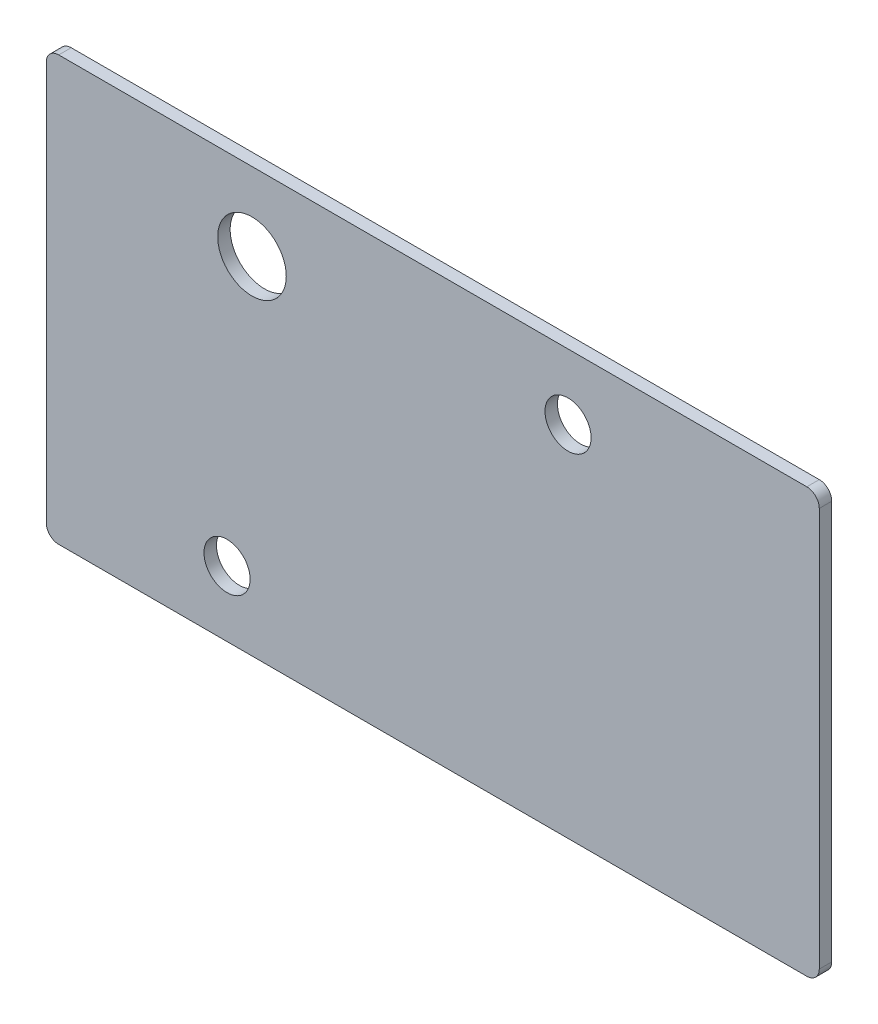
ISO-10303-21;
HEADER;
FILE_DESCRIPTION(('STEP AP214'),'2;1');
FILE_NAME('part.step','',(''),(''),'','','');
FILE_SCHEMA(('AUTOMOTIVE_DESIGN { 1 0 10303 214 1 1 1 1 }'));
ENDSEC;
DATA;
#1=APPLICATION_CONTEXT('core data for automotive mechanical design processes');
#2=APPLICATION_PROTOCOL_DEFINITION('international standard','automotive_design',2000,#1);
#3=PRODUCT_CONTEXT('',#1,'mechanical');
#4=PRODUCT('Part','Part','',(#3));
#5=PRODUCT_RELATED_PRODUCT_CATEGORY('part','',(#4));
#6=PRODUCT_DEFINITION_FORMATION('','',#4);
#7=PRODUCT_DEFINITION_CONTEXT('part definition',#1,'design');
#8=PRODUCT_DEFINITION('design','',#6,#7);
#9=PRODUCT_DEFINITION_SHAPE('','',#8);
#10=(LENGTH_UNIT() NAMED_UNIT(*) SI_UNIT(.MILLI.,.METRE.));
#11=(NAMED_UNIT(*) PLANE_ANGLE_UNIT() SI_UNIT($,.RADIAN.));
#12=(NAMED_UNIT(*) SI_UNIT($,.STERADIAN.) SOLID_ANGLE_UNIT());
#13=UNCERTAINTY_MEASURE_WITH_UNIT(LENGTH_MEASURE(1.E-05),#10,'distance_accuracy_value','');
#14=(GEOMETRIC_REPRESENTATION_CONTEXT(3) GLOBAL_UNCERTAINTY_ASSIGNED_CONTEXT((#13)) GLOBAL_UNIT_ASSIGNED_CONTEXT((#10,
#11,#12)) REPRESENTATION_CONTEXT('',''));
#15=CARTESIAN_POINT('',(0.,0.,0.));
#16=DIRECTION('',(0.,0.,1.));
#17=DIRECTION('',(1.,0.,0.));
#18=AXIS2_PLACEMENT_3D('',#15,#16,#17);
#19=CARTESIAN_POINT('',(-5.,-1.25,1.));
#20=DIRECTION('',(0.,0.,1.));
#21=DIRECTION('',(1.,0.,0.));
#22=AXIS2_PLACEMENT_3D('',#19,#20,#21);
#23=PLANE('',#22);
#24=CARTESIAN_POINT('',(10.5,25.5,1.));
#25=DIRECTION('',(0.,0.,1.));
#26=DIRECTION('',(1.,0.,0.));
#27=AXIS2_PLACEMENT_3D('',#24,#25,#26);
#28=CIRCLE('',#27,2.75);
#29=CARTESIAN_POINT('',(13.25,25.5,1.));
#30=VERTEX_POINT('',#29);
#31=EDGE_CURVE('E191',#30,#30,#28,.T.);
#32=ORIENTED_EDGE('',*,*,#31,.F.);
#33=EDGE_LOOP('',(#32));
#34=FACE_BOUND('',#33,.T.);
#35=CARTESIAN_POINT('',(35.85,26.5,1.));
#36=DIRECTION('',(0.,0.,1.));
#37=DIRECTION('',(1.,0.,0.));
#38=AXIS2_PLACEMENT_3D('',#35,#36,#37);
#39=CIRCLE('',#38,1.85);
#40=CARTESIAN_POINT('',(37.7,26.5,1.));
#41=VERTEX_POINT('',#40);
#42=EDGE_CURVE('E134',#41,#41,#39,.T.);
#43=ORIENTED_EDGE('',*,*,#42,.F.);
#44=EDGE_LOOP('',(#43));
#45=FACE_BOUND('',#44,.T.);
#46=CARTESIAN_POINT('',(-5.,-1.25,1.));
#47=DIRECTION('',(0.,0.,1.));
#48=DIRECTION('',(1.,0.,0.));
#49=AXIS2_PLACEMENT_3D('',#46,#47,#48);
#50=CIRCLE('',#49,1.);
#51=CARTESIAN_POINT('',(-6.,-1.25,1.));
#52=VERTEX_POINT('',#51);
#53=CARTESIAN_POINT('',(-5.,-2.25,1.));
#54=VERTEX_POINT('',#53);
#55=EDGE_CURVE('E145',#52,#54,#50,.T.);
#56=ORIENTED_EDGE('',*,*,#55,.T.);
#57=DIRECTION('',(1.,0.,0.));
#58=VECTOR('',#57,1.);
#59=CARTESIAN_POINT('',(-5.,-2.25,1.));
#60=LINE('',#59,#58);
#61=CARTESIAN_POINT('',(55.,-2.25,1.));
#62=VERTEX_POINT('',#61);
#63=EDGE_CURVE('E93',#54,#62,#60,.T.);
#64=ORIENTED_EDGE('',*,*,#63,.T.);
#65=CARTESIAN_POINT('',(55.,-1.25,1.));
#66=DIRECTION('',(0.,0.,1.));
#67=DIRECTION('',(1.,0.,0.));
#68=AXIS2_PLACEMENT_3D('',#65,#66,#67);
#69=CIRCLE('',#68,1.);
#70=CARTESIAN_POINT('',(56.,-1.25,1.));
#71=VERTEX_POINT('',#70);
#72=EDGE_CURVE('E160',#62,#71,#69,.T.);
#73=ORIENTED_EDGE('',*,*,#72,.T.);
#74=DIRECTION('',(0.,1.,0.));
#75=VECTOR('',#74,1.);
#76=CARTESIAN_POINT('',(56.,-1.25,1.));
#77=LINE('',#76,#75);
#78=CARTESIAN_POINT('',(56.,30.75,1.));
#79=VERTEX_POINT('',#78);
#80=EDGE_CURVE('E173',#71,#79,#77,.T.);
#81=ORIENTED_EDGE('',*,*,#80,.T.);
#82=CARTESIAN_POINT('',(55.,30.75,1.));
#83=DIRECTION('',(0.,0.,1.));
#84=DIRECTION('',(1.,0.,0.));
#85=AXIS2_PLACEMENT_3D('',#82,#83,#84);
#86=CIRCLE('',#85,1.);
#87=CARTESIAN_POINT('',(55.,31.75,1.));
#88=VERTEX_POINT('',#87);
#89=EDGE_CURVE('E112',#79,#88,#86,.T.);
#90=ORIENTED_EDGE('',*,*,#89,.T.);
#91=DIRECTION('',(-1.,0.,0.));
#92=VECTOR('',#91,1.);
#93=CARTESIAN_POINT('',(-5.,31.75,1.));
#94=LINE('',#93,#92);
#95=CARTESIAN_POINT('',(-5.,31.75,1.));
#96=VERTEX_POINT('',#95);
#97=EDGE_CURVE('E106',#88,#96,#94,.T.);
#98=ORIENTED_EDGE('',*,*,#97,.T.);
#99=CARTESIAN_POINT('',(-5.,30.75,1.));
#100=DIRECTION('',(0.,0.,1.));
#101=DIRECTION('',(1.,0.,0.));
#102=AXIS2_PLACEMENT_3D('',#99,#100,#101);
#103=CIRCLE('',#102,1.);
#104=CARTESIAN_POINT('',(-6.,30.75,1.));
#105=VERTEX_POINT('',#104);
#106=EDGE_CURVE('E110',#96,#105,#103,.T.);
#107=ORIENTED_EDGE('',*,*,#106,.T.);
#108=DIRECTION('',(0.,-1.,0.));
#109=VECTOR('',#108,1.);
#110=CARTESIAN_POINT('',(-6.,-1.25,1.));
#111=LINE('',#110,#109);
#112=EDGE_CURVE('E50',#105,#52,#111,.T.);
#113=ORIENTED_EDGE('',*,*,#112,.T.);
#114=EDGE_LOOP('',(#56,#64,#73,#81,#90,#98,#107,#113));
#115=FACE_BOUND('',#114,.T.);
#116=CARTESIAN_POINT('',(8.5,3.,1.));
#117=DIRECTION('',(0.,0.,1.));
#118=DIRECTION('',(1.,0.,0.));
#119=AXIS2_PLACEMENT_3D('',#116,#117,#118);
#120=CIRCLE('',#119,1.85);
#121=CARTESIAN_POINT('',(10.35,3.,1.));
#122=VERTEX_POINT('',#121);
#123=EDGE_CURVE('E182',#122,#122,#120,.T.);
#124=ORIENTED_EDGE('',*,*,#123,.F.);
#125=EDGE_LOOP('',(#124));
#126=FACE_BOUND('',#125,.T.);
#127=ADVANCED_FACE('F33',(#34,#45,#115,#126),#23,.T.);
#128=CARTESIAN_POINT('',(-5.,-1.25,0.));
#129=DIRECTION('',(0.,0.,1.));
#130=DIRECTION('',(1.,0.,0.));
#131=AXIS2_PLACEMENT_3D('',#128,#129,#130);
#132=PLANE('',#131);
#133=CARTESIAN_POINT('',(10.5,25.5,0.));
#134=DIRECTION('',(0.,0.,1.));
#135=DIRECTION('',(1.,0.,0.));
#136=AXIS2_PLACEMENT_3D('',#133,#134,#135);
#137=CIRCLE('',#136,2.75);
#138=CARTESIAN_POINT('',(13.25,25.5,0.));
#139=VERTEX_POINT('',#138);
#140=EDGE_CURVE('E188',#139,#139,#137,.T.);
#141=ORIENTED_EDGE('',*,*,#140,.T.);
#142=EDGE_LOOP('',(#141));
#143=FACE_BOUND('',#142,.T.);
#144=CARTESIAN_POINT('',(35.85,26.5,0.));
#145=DIRECTION('',(0.,0.,1.));
#146=DIRECTION('',(1.,0.,0.));
#147=AXIS2_PLACEMENT_3D('',#144,#145,#146);
#148=CIRCLE('',#147,1.85);
#149=CARTESIAN_POINT('',(37.7,26.5,0.));
#150=VERTEX_POINT('',#149);
#151=EDGE_CURVE('E179',#150,#150,#148,.T.);
#152=ORIENTED_EDGE('',*,*,#151,.T.);
#153=EDGE_LOOP('',(#152));
#154=FACE_BOUND('',#153,.T.);
#155=CARTESIAN_POINT('',(-5.,-1.25,0.));
#156=DIRECTION('',(0.,0.,1.));
#157=DIRECTION('',(1.,0.,0.));
#158=AXIS2_PLACEMENT_3D('',#155,#156,#157);
#159=CIRCLE('',#158,1.);
#160=CARTESIAN_POINT('',(-6.,-1.25,0.));
#161=VERTEX_POINT('',#160);
#162=CARTESIAN_POINT('',(-5.,-2.25,0.));
#163=VERTEX_POINT('',#162);
#164=EDGE_CURVE('E130',#161,#163,#159,.T.);
#165=ORIENTED_EDGE('',*,*,#164,.F.);
#166=DIRECTION('',(0.,-1.,0.));
#167=VECTOR('',#166,1.);
#168=CARTESIAN_POINT('',(-6.,-1.25,0.));
#169=LINE('',#168,#167);
#170=CARTESIAN_POINT('',(-6.,30.75,0.));
#171=VERTEX_POINT('',#170);
#172=EDGE_CURVE('E85',#171,#161,#169,.T.);
#173=ORIENTED_EDGE('',*,*,#172,.F.);
#174=CARTESIAN_POINT('',(-5.,30.75,0.));
#175=DIRECTION('',(0.,0.,1.));
#176=DIRECTION('',(1.,0.,0.));
#177=AXIS2_PLACEMENT_3D('',#174,#175,#176);
#178=CIRCLE('',#177,1.);
#179=CARTESIAN_POINT('',(-5.,31.75,0.));
#180=VERTEX_POINT('',#179);
#181=EDGE_CURVE('E79',#180,#171,#178,.T.);
#182=ORIENTED_EDGE('',*,*,#181,.F.);
#183=DIRECTION('',(-1.,0.,0.));
#184=VECTOR('',#183,1.);
#185=CARTESIAN_POINT('',(-5.,31.75,0.));
#186=LINE('',#185,#184);
#187=CARTESIAN_POINT('',(55.,31.75,0.));
#188=VERTEX_POINT('',#187);
#189=EDGE_CURVE('E120',#188,#180,#186,.T.);
#190=ORIENTED_EDGE('',*,*,#189,.F.);
#191=CARTESIAN_POINT('',(55.,30.75,0.));
#192=DIRECTION('',(0.,0.,1.));
#193=DIRECTION('',(1.,0.,0.));
#194=AXIS2_PLACEMENT_3D('',#191,#192,#193);
#195=CIRCLE('',#194,1.);
#196=CARTESIAN_POINT('',(56.,30.75,0.));
#197=VERTEX_POINT('',#196);
#198=EDGE_CURVE('E140',#197,#188,#195,.T.);
#199=ORIENTED_EDGE('',*,*,#198,.F.);
#200=DIRECTION('',(0.,1.,0.));
#201=VECTOR('',#200,1.);
#202=CARTESIAN_POINT('',(56.,-1.25,0.));
#203=LINE('',#202,#201);
#204=CARTESIAN_POINT('',(56.,-1.25,0.));
#205=VERTEX_POINT('',#204);
#206=EDGE_CURVE('E138',#205,#197,#203,.T.);
#207=ORIENTED_EDGE('',*,*,#206,.F.);
#208=CARTESIAN_POINT('',(55.,-1.25,0.));
#209=DIRECTION('',(0.,0.,1.));
#210=DIRECTION('',(1.,0.,0.));
#211=AXIS2_PLACEMENT_3D('',#208,#209,#210);
#212=CIRCLE('',#211,1.);
#213=CARTESIAN_POINT('',(55.,-2.25,0.));
#214=VERTEX_POINT('',#213);
#215=EDGE_CURVE('E136',#214,#205,#212,.T.);
#216=ORIENTED_EDGE('',*,*,#215,.F.);
#217=DIRECTION('',(1.,0.,0.));
#218=VECTOR('',#217,1.);
#219=CARTESIAN_POINT('',(-5.,-2.25,0.));
#220=LINE('',#219,#218);
#221=EDGE_CURVE('E133',#163,#214,#220,.T.);
#222=ORIENTED_EDGE('',*,*,#221,.F.);
#223=EDGE_LOOP('',(#165,#173,#182,#190,#199,#207,#216,#222));
#224=FACE_BOUND('',#223,.T.);
#225=CARTESIAN_POINT('',(8.5,3.,0.));
#226=DIRECTION('',(0.,0.,1.));
#227=DIRECTION('',(1.,0.,0.));
#228=AXIS2_PLACEMENT_3D('',#225,#226,#227);
#229=CIRCLE('',#228,1.85);
#230=CARTESIAN_POINT('',(10.35,3.,0.));
#231=VERTEX_POINT('',#230);
#232=EDGE_CURVE('E185',#231,#231,#229,.T.);
#233=ORIENTED_EDGE('',*,*,#232,.T.);
#234=EDGE_LOOP('',(#233));
#235=FACE_BOUND('',#234,.T.);
#236=ADVANCED_FACE('F164',(#143,#154,#224,#235),#132,.F.);
#237=CARTESIAN_POINT('',(-5.,-1.25,1.));
#238=DIRECTION('',(0.,0.,-1.));
#239=DIRECTION('',(-1.,0.,0.));
#240=AXIS2_PLACEMENT_3D('',#237,#238,#239);
#241=CYLINDRICAL_SURFACE('',#240,1.);
#242=ORIENTED_EDGE('',*,*,#164,.T.);
#243=DIRECTION('',(0.,0.,-1.));
#244=VECTOR('',#243,1.);
#245=CARTESIAN_POINT('',(-5.,-2.25,1.));
#246=LINE('',#245,#244);
#247=EDGE_CURVE('E11',#54,#163,#246,.T.);
#248=ORIENTED_EDGE('',*,*,#247,.F.);
#249=ORIENTED_EDGE('',*,*,#55,.F.);
#250=DIRECTION('',(0.,0.,-1.));
#251=VECTOR('',#250,1.);
#252=CARTESIAN_POINT('',(-6.,-1.25,1.));
#253=LINE('',#252,#251);
#254=EDGE_CURVE('E126',#52,#161,#253,.T.);
#255=ORIENTED_EDGE('',*,*,#254,.T.);
#256=EDGE_LOOP('',(#242,#248,#249,#255));
#257=FACE_BOUND('',#256,.T.);
#258=ADVANCED_FACE('F35',(#257),#241,.T.);
#259=CARTESIAN_POINT('',(-5.,-2.25,1.));
#260=DIRECTION('',(0.,1.,0.));
#261=DIRECTION('',(-1.,0.,0.));
#262=AXIS2_PLACEMENT_3D('',#259,#260,#261);
#263=PLANE('',#262);
#264=ORIENTED_EDGE('',*,*,#221,.T.);
#265=DIRECTION('',(0.,0.,-1.));
#266=VECTOR('',#265,1.);
#267=CARTESIAN_POINT('',(55.,-2.25,1.));
#268=LINE('',#267,#266);
#269=EDGE_CURVE('E42',#62,#214,#268,.T.);
#270=ORIENTED_EDGE('',*,*,#269,.F.);
#271=ORIENTED_EDGE('',*,*,#63,.F.);
#272=ORIENTED_EDGE('',*,*,#247,.T.);
#273=EDGE_LOOP('',(#264,#270,#271,#272));
#274=FACE_BOUND('',#273,.T.);
#275=ADVANCED_FACE('F222',(#274),#263,.F.);
#276=CARTESIAN_POINT('',(55.,-1.25,1.));
#277=DIRECTION('',(0.,0.,-1.));
#278=DIRECTION('',(-1.,0.,0.));
#279=AXIS2_PLACEMENT_3D('',#276,#277,#278);
#280=CYLINDRICAL_SURFACE('',#279,1.);
#281=ORIENTED_EDGE('',*,*,#215,.T.);
#282=DIRECTION('',(0.,0.,-1.));
#283=VECTOR('',#282,1.);
#284=CARTESIAN_POINT('',(56.,-1.25,1.));
#285=LINE('',#284,#283);
#286=EDGE_CURVE('E152',#71,#205,#285,.T.);
#287=ORIENTED_EDGE('',*,*,#286,.F.);
#288=ORIENTED_EDGE('',*,*,#72,.F.);
#289=ORIENTED_EDGE('',*,*,#269,.T.);
#290=EDGE_LOOP('',(#281,#287,#288,#289));
#291=FACE_BOUND('',#290,.T.);
#292=ADVANCED_FACE('F158',(#291),#280,.T.);
#293=CARTESIAN_POINT('',(56.,-1.25,1.));
#294=DIRECTION('',(-1.,0.,0.));
#295=DIRECTION('',(0.,0.,1.));
#296=AXIS2_PLACEMENT_3D('',#293,#294,#295);
#297=PLANE('',#296);
#298=ORIENTED_EDGE('',*,*,#206,.T.);
#299=DIRECTION('',(0.,0.,-1.));
#300=VECTOR('',#299,1.);
#301=CARTESIAN_POINT('',(56.,30.75,1.));
#302=LINE('',#301,#300);
#303=EDGE_CURVE('E149',#79,#197,#302,.T.);
#304=ORIENTED_EDGE('',*,*,#303,.F.);
#305=ORIENTED_EDGE('',*,*,#80,.F.);
#306=ORIENTED_EDGE('',*,*,#286,.T.);
#307=EDGE_LOOP('',(#298,#304,#305,#306));
#308=FACE_BOUND('',#307,.T.);
#309=ADVANCED_FACE('F169',(#308),#297,.F.);
#310=CARTESIAN_POINT('',(55.,30.75,1.));
#311=DIRECTION('',(0.,0.,-1.));
#312=DIRECTION('',(-1.,0.,0.));
#313=AXIS2_PLACEMENT_3D('',#310,#311,#312);
#314=CYLINDRICAL_SURFACE('',#313,1.);
#315=ORIENTED_EDGE('',*,*,#198,.T.);
#316=DIRECTION('',(0.,0.,-1.));
#317=VECTOR('',#316,1.);
#318=CARTESIAN_POINT('',(55.,31.75,1.));
#319=LINE('',#318,#317);
#320=EDGE_CURVE('E121',#88,#188,#319,.T.);
#321=ORIENTED_EDGE('',*,*,#320,.F.);
#322=ORIENTED_EDGE('',*,*,#89,.F.);
#323=ORIENTED_EDGE('',*,*,#303,.T.);
#324=EDGE_LOOP('',(#315,#321,#322,#323));
#325=FACE_BOUND('',#324,.T.);
#326=ADVANCED_FACE('F172',(#325),#314,.T.);
#327=CARTESIAN_POINT('',(-5.,31.75,1.));
#328=DIRECTION('',(0.,-1.,0.));
#329=DIRECTION('',(0.,0.,-1.));
#330=AXIS2_PLACEMENT_3D('',#327,#328,#329);
#331=PLANE('',#330);
#332=ORIENTED_EDGE('',*,*,#189,.T.);
#333=DIRECTION('',(0.,0.,-1.));
#334=VECTOR('',#333,1.);
#335=CARTESIAN_POINT('',(-5.,31.75,1.));
#336=LINE('',#335,#334);
#337=EDGE_CURVE('E117',#96,#180,#336,.T.);
#338=ORIENTED_EDGE('',*,*,#337,.F.);
#339=ORIENTED_EDGE('',*,*,#97,.F.);
#340=ORIENTED_EDGE('',*,*,#320,.T.);
#341=EDGE_LOOP('',(#332,#338,#339,#340));
#342=FACE_BOUND('',#341,.T.);
#343=ADVANCED_FACE('F118',(#342),#331,.F.);
#344=CARTESIAN_POINT('',(-5.,30.75,1.));
#345=DIRECTION('',(0.,0.,-1.));
#346=DIRECTION('',(-1.,0.,0.));
#347=AXIS2_PLACEMENT_3D('',#344,#345,#346);
#348=CYLINDRICAL_SURFACE('',#347,1.);
#349=ORIENTED_EDGE('',*,*,#181,.T.);
#350=DIRECTION('',(0.,0.,-1.));
#351=VECTOR('',#350,1.);
#352=CARTESIAN_POINT('',(-6.,30.75,1.));
#353=LINE('',#352,#351);
#354=EDGE_CURVE('E122',#105,#171,#353,.T.);
#355=ORIENTED_EDGE('',*,*,#354,.F.);
#356=ORIENTED_EDGE('',*,*,#106,.F.);
#357=ORIENTED_EDGE('',*,*,#337,.T.);
#358=EDGE_LOOP('',(#349,#355,#356,#357));
#359=FACE_BOUND('',#358,.T.);
#360=ADVANCED_FACE('F124',(#359),#348,.T.);
#361=CARTESIAN_POINT('',(-6.,-1.25,1.));
#362=DIRECTION('',(1.,0.,0.));
#363=DIRECTION('',(0.,0.,-1.));
#364=AXIS2_PLACEMENT_3D('',#361,#362,#363);
#365=PLANE('',#364);
#366=ORIENTED_EDGE('',*,*,#172,.T.);
#367=ORIENTED_EDGE('',*,*,#254,.F.);
#368=ORIENTED_EDGE('',*,*,#112,.F.);
#369=ORIENTED_EDGE('',*,*,#354,.T.);
#370=EDGE_LOOP('',(#366,#367,#368,#369));
#371=FACE_BOUND('',#370,.T.);
#372=ADVANCED_FACE('F214',(#371),#365,.F.);
#373=CARTESIAN_POINT('',(35.85,26.5,1.));
#374=DIRECTION('',(0.,0.,-1.));
#375=DIRECTION('',(-1.,0.,0.));
#376=AXIS2_PLACEMENT_3D('',#373,#374,#375);
#377=CYLINDRICAL_SURFACE('',#376,1.85);
#378=ORIENTED_EDGE('',*,*,#42,.T.);
#379=EDGE_LOOP('',(#378));
#380=FACE_BOUND('',#379,.T.);
#381=ORIENTED_EDGE('',*,*,#151,.F.);
#382=EDGE_LOOP('',(#381));
#383=FACE_BOUND('',#382,.T.);
#384=ADVANCED_FACE('F211',(#380,#383),#377,.F.);
#385=CARTESIAN_POINT('',(8.5,3.,1.));
#386=DIRECTION('',(0.,0.,-1.));
#387=DIRECTION('',(-1.,0.,0.));
#388=AXIS2_PLACEMENT_3D('',#385,#386,#387);
#389=CYLINDRICAL_SURFACE('',#388,1.85);
#390=ORIENTED_EDGE('',*,*,#123,.T.);
#391=EDGE_LOOP('',(#390));
#392=FACE_BOUND('',#391,.T.);
#393=ORIENTED_EDGE('',*,*,#232,.F.);
#394=EDGE_LOOP('',(#393));
#395=FACE_BOUND('',#394,.T.);
#396=ADVANCED_FACE('F202',(#392,#395),#389,.F.);
#397=CARTESIAN_POINT('',(10.5,25.5,0.));
#398=DIRECTION('',(0.,0.,1.));
#399=DIRECTION('',(1.,0.,0.));
#400=AXIS2_PLACEMENT_3D('',#397,#398,#399);
#401=CYLINDRICAL_SURFACE('',#400,2.75);
#402=ORIENTED_EDGE('',*,*,#140,.F.);
#403=EDGE_LOOP('',(#402));
#404=FACE_BOUND('',#403,.T.);
#405=ORIENTED_EDGE('',*,*,#31,.T.);
#406=EDGE_LOOP('',(#405));
#407=FACE_BOUND('',#406,.T.);
#408=ADVANCED_FACE('F199',(#404,#407),#401,.F.);
#409=CLOSED_SHELL('',(#127,#236,#258,#275,#292,#309,#326,#343,#360,#372,#384,#396,#408));
#410=MANIFOLD_SOLID_BREP('B2',#409);
#411=ADVANCED_BREP_SHAPE_REPRESENTATION('',(#18,#410),#14);
#412=SHAPE_DEFINITION_REPRESENTATION(#9,#411);
ENDSEC;
END-ISO-10303-21;
